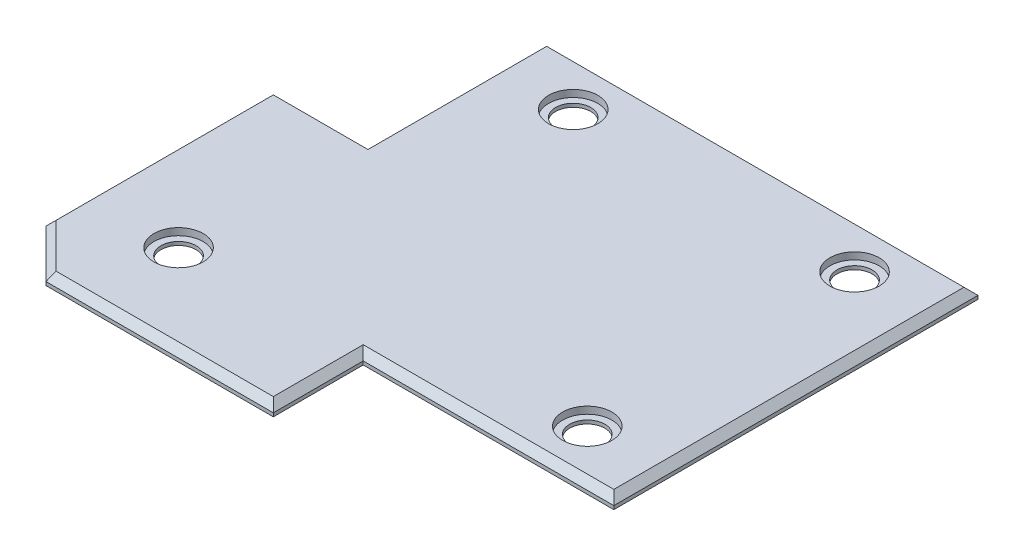
ISO-10303-21;
HEADER;
FILE_DESCRIPTION(('STEP AP214'),'2;1');
FILE_NAME('part.step','',(''),(''),'','','');
FILE_SCHEMA(('AUTOMOTIVE_DESIGN { 1 0 10303 214 1 1 1 1 }'));
ENDSEC;
DATA;
#1=APPLICATION_CONTEXT('core data for automotive mechanical design processes');
#2=APPLICATION_PROTOCOL_DEFINITION('international standard','automotive_design',2000,#1);
#3=PRODUCT_CONTEXT('',#1,'mechanical');
#4=PRODUCT('Part','Part','',(#3));
#5=PRODUCT_RELATED_PRODUCT_CATEGORY('part','',(#4));
#6=PRODUCT_DEFINITION_FORMATION('','',#4);
#7=PRODUCT_DEFINITION_CONTEXT('part definition',#1,'design');
#8=PRODUCT_DEFINITION('design','',#6,#7);
#9=PRODUCT_DEFINITION_SHAPE('','',#8);
#10=(LENGTH_UNIT() NAMED_UNIT(*) SI_UNIT(.MILLI.,.METRE.));
#11=(NAMED_UNIT(*) PLANE_ANGLE_UNIT() SI_UNIT($,.RADIAN.));
#12=(NAMED_UNIT(*) SI_UNIT($,.STERADIAN.) SOLID_ANGLE_UNIT());
#13=UNCERTAINTY_MEASURE_WITH_UNIT(LENGTH_MEASURE(1.E-05),#10,'distance_accuracy_value','');
#14=(GEOMETRIC_REPRESENTATION_CONTEXT(3) GLOBAL_UNCERTAINTY_ASSIGNED_CONTEXT((#13)) GLOBAL_UNIT_ASSIGNED_CONTEXT((#10,
#11,#12)) REPRESENTATION_CONTEXT('',''));
#15=CARTESIAN_POINT('',(0.,0.,0.));
#16=DIRECTION('',(0.,0.,1.));
#17=DIRECTION('',(1.,0.,0.));
#18=AXIS2_PLACEMENT_3D('',#15,#16,#17);
#19=CARTESIAN_POINT('',(21.1851643736294,1.5,-18.54562572709));
#20=DIRECTION('',(0.,1.,0.));
#21=DIRECTION('',(0.,0.,1.));
#22=AXIS2_PLACEMENT_3D('',#19,#20,#21);
#23=CYLINDRICAL_SURFACE('',#22,2.5);
#24=CARTESIAN_POINT('',(21.1851643736294,2.,-18.54562572709));
#25=DIRECTION('',(0.,-1.,0.));
#26=DIRECTION('',(0.,0.,-1.));
#27=AXIS2_PLACEMENT_3D('',#24,#25,#26);
#28=CIRCLE('',#27,2.5);
#29=CARTESIAN_POINT('',(21.1851643736294,2.,-21.04562572709));
#30=VERTEX_POINT('',#29);
#31=EDGE_CURVE('E188',#30,#30,#28,.T.);
#32=ORIENTED_EDGE('',*,*,#31,.T.);
#33=EDGE_LOOP('',(#32));
#34=FACE_BOUND('',#33,.T.);
#35=CARTESIAN_POINT('',(21.1851643736294,2.5,-18.54562572709));
#36=DIRECTION('',(0.,1.,0.));
#37=DIRECTION('',(0.,0.,1.));
#38=AXIS2_PLACEMENT_3D('',#35,#36,#37);
#39=CIRCLE('',#38,2.5);
#40=CARTESIAN_POINT('',(21.1851643736294,2.5,-16.04562572709));
#41=VERTEX_POINT('',#40);
#42=EDGE_CURVE('E192',#41,#41,#39,.F.);
#43=ORIENTED_EDGE('',*,*,#42,.F.);
#44=EDGE_LOOP('',(#43));
#45=FACE_BOUND('',#44,.T.);
#46=ADVANCED_FACE('F41',(#34,#45),#23,.F.);
#47=CARTESIAN_POINT('',(-18.8148356263706,1.5,-18.54562572709));
#48=DIRECTION('',(0.,1.,0.));
#49=DIRECTION('',(0.,0.,1.));
#50=AXIS2_PLACEMENT_3D('',#47,#48,#49);
#51=CYLINDRICAL_SURFACE('',#50,2.5);
#52=CARTESIAN_POINT('',(-18.8148356263706,2.,-18.54562572709));
#53=DIRECTION('',(0.,-1.,0.));
#54=DIRECTION('',(0.,0.,-1.));
#55=AXIS2_PLACEMENT_3D('',#52,#53,#54);
#56=CIRCLE('',#55,2.5);
#57=CARTESIAN_POINT('',(-18.8148356263706,2.,-21.04562572709));
#58=VERTEX_POINT('',#57);
#59=EDGE_CURVE('E191',#58,#58,#56,.T.);
#60=ORIENTED_EDGE('',*,*,#59,.T.);
#61=EDGE_LOOP('',(#60));
#62=FACE_BOUND('',#61,.T.);
#63=CARTESIAN_POINT('',(-18.8148356263706,2.5,-18.54562572709));
#64=DIRECTION('',(0.,1.,0.));
#65=DIRECTION('',(0.,0.,1.));
#66=AXIS2_PLACEMENT_3D('',#63,#64,#65);
#67=CIRCLE('',#66,2.5);
#68=CARTESIAN_POINT('',(-18.8148356263706,2.5,-16.04562572709));
#69=VERTEX_POINT('',#68);
#70=EDGE_CURVE('E208',#69,#69,#67,.F.);
#71=ORIENTED_EDGE('',*,*,#70,.F.);
#72=EDGE_LOOP('',(#71));
#73=FACE_BOUND('',#72,.T.);
#74=ADVANCED_FACE('F396',(#62,#73),#51,.F.);
#75=CARTESIAN_POINT('',(21.1851643736294,1.5,19.45437427291));
#76=DIRECTION('',(0.,1.,0.));
#77=DIRECTION('',(0.,0.,1.));
#78=AXIS2_PLACEMENT_3D('',#75,#76,#77);
#79=CYLINDRICAL_SURFACE('',#78,2.5);
#80=CARTESIAN_POINT('',(21.1851643736294,2.,19.45437427291));
#81=DIRECTION('',(0.,-1.,0.));
#82=DIRECTION('',(0.,0.,-1.));
#83=AXIS2_PLACEMENT_3D('',#80,#81,#82);
#84=CIRCLE('',#83,2.5);
#85=CARTESIAN_POINT('',(21.1851643736294,2.,16.95437427291));
#86=VERTEX_POINT('',#85);
#87=EDGE_CURVE('E195',#86,#86,#84,.T.);
#88=ORIENTED_EDGE('',*,*,#87,.T.);
#89=EDGE_LOOP('',(#88));
#90=FACE_BOUND('',#89,.T.);
#91=CARTESIAN_POINT('',(21.1851643736294,2.5,19.45437427291));
#92=DIRECTION('',(0.,1.,0.));
#93=DIRECTION('',(0.,0.,1.));
#94=AXIS2_PLACEMENT_3D('',#91,#92,#93);
#95=CIRCLE('',#94,2.5);
#96=CARTESIAN_POINT('',(21.1851643736294,2.5,21.95437427291));
#97=VERTEX_POINT('',#96);
#98=EDGE_CURVE('E204',#97,#97,#95,.F.);
#99=ORIENTED_EDGE('',*,*,#98,.F.);
#100=EDGE_LOOP('',(#99));
#101=FACE_BOUND('',#100,.T.);
#102=ADVANCED_FACE('F402',(#90,#101),#79,.F.);
#103=CARTESIAN_POINT('',(-29.8548356263706,1.5,26.5291378794875));
#104=DIRECTION('',(0.,1.,0.));
#105=DIRECTION('',(0.,0.,1.));
#106=AXIS2_PLACEMENT_3D('',#103,#104,#105);
#107=CYLINDRICAL_SURFACE('',#106,2.5);
#108=CARTESIAN_POINT('',(-29.8548356263706,2.,26.5291378794875));
#109=DIRECTION('',(0.,-1.,0.));
#110=DIRECTION('',(0.,0.,-1.));
#111=AXIS2_PLACEMENT_3D('',#108,#109,#110);
#112=CIRCLE('',#111,2.5);
#113=CARTESIAN_POINT('',(-29.8548356263706,2.,24.0291378794875));
#114=VERTEX_POINT('',#113);
#115=EDGE_CURVE('E198',#114,#114,#112,.T.);
#116=ORIENTED_EDGE('',*,*,#115,.T.);
#117=EDGE_LOOP('',(#116));
#118=FACE_BOUND('',#117,.T.);
#119=CARTESIAN_POINT('',(-29.8548356263706,2.5,26.5291378794875));
#120=DIRECTION('',(0.,1.,0.));
#121=DIRECTION('',(0.,0.,1.));
#122=AXIS2_PLACEMENT_3D('',#119,#120,#121);
#123=CIRCLE('',#122,2.5);
#124=CARTESIAN_POINT('',(-29.8548356263706,2.5,29.0291378794875));
#125=VERTEX_POINT('',#124);
#126=EDGE_CURVE('E201',#125,#125,#123,.F.);
#127=ORIENTED_EDGE('',*,*,#126,.F.);
#128=EDGE_LOOP('',(#127));
#129=FACE_BOUND('',#128,.T.);
#130=ADVANCED_FACE('F407',(#118,#129),#107,.F.);
#131=CARTESIAN_POINT('',(-29.4806035931873,3.5,-0.0264334137700193));
#132=DIRECTION('',(1.,0.,0.));
#133=DIRECTION('',(0.,0.,-1.));
#134=AXIS2_PLACEMENT_3D('',#131,#132,#133);
#135=PLANE('',#134);
#136=DIRECTION('',(0.,-1.,0.));
#137=VECTOR('',#136,1.);
#138=CARTESIAN_POINT('',(-29.4806035931873,3.5,-0.0264334137700193));
#139=LINE('',#138,#137);
#140=CARTESIAN_POINT('',(-29.4806035931873,2.49999999999999,-0.0264334137700193));
#141=VERTEX_POINT('',#140);
#142=CARTESIAN_POINT('',(-29.4806035931873,2.,-0.0264334137700193));
#143=VERTEX_POINT('',#142);
#144=EDGE_CURVE('E185',#141,#143,#139,.T.);
#145=ORIENTED_EDGE('',*,*,#144,.F.);
#146=DIRECTION('',(0.,0.,-1.));
#147=VECTOR('',#146,1.);
#148=CARTESIAN_POINT('',(-29.4806035931873,2.49999999999999,-0.0264334137700193));
#149=LINE('',#148,#147);
#150=CARTESIAN_POINT('',(-29.4806035931873,2.49999999999999,-25.4359182046136));
#151=VERTEX_POINT('',#150);
#152=EDGE_CURVE('E234',#141,#151,#149,.T.);
#153=ORIENTED_EDGE('',*,*,#152,.T.);
#154=DIRECTION('',(0.,-1.,0.));
#155=VECTOR('',#154,1.);
#156=CARTESIAN_POINT('',(-29.4806035931873,3.5,-25.4359182046136));
#157=LINE('',#156,#155);
#158=CARTESIAN_POINT('',(-29.4806035931873,2.,-25.4359182046136));
#159=VERTEX_POINT('',#158);
#160=EDGE_CURVE('E152',#151,#159,#157,.T.);
#161=ORIENTED_EDGE('',*,*,#160,.T.);
#162=DIRECTION('',(0.,0.,1.));
#163=VECTOR('',#162,1.);
#164=CARTESIAN_POINT('',(-29.4806035931873,2.,-0.0264334137700193));
#165=LINE('',#164,#163);
#166=EDGE_CURVE('E163',#159,#143,#165,.T.);
#167=ORIENTED_EDGE('',*,*,#166,.T.);
#168=EDGE_LOOP('',(#145,#153,#161,#167));
#169=FACE_BOUND('',#168,.T.);
#170=ADVANCED_FACE('F352',(#169),#135,.F.);
#171=CARTESIAN_POINT('',(-42.9335057092703,3.5,-0.0264334137700193));
#172=DIRECTION('',(0.,0.,1.));
#173=DIRECTION('',(1.,0.,0.));
#174=AXIS2_PLACEMENT_3D('',#171,#172,#173);
#175=PLANE('',#174);
#176=DIRECTION('',(0.,-1.,0.));
#177=VECTOR('',#176,1.);
#178=CARTESIAN_POINT('',(-42.9335057092703,3.5,-0.0264334137700193));
#179=LINE('',#178,#177);
#180=CARTESIAN_POINT('',(-42.9335057092703,2.49999999999999,-0.0264334137700193));
#181=VERTEX_POINT('',#180);
#182=CARTESIAN_POINT('',(-42.9335057092703,2.,-0.0264334137700176));
#183=VERTEX_POINT('',#182);
#184=EDGE_CURVE('E183',#181,#183,#179,.T.);
#185=ORIENTED_EDGE('',*,*,#184,.F.);
#186=DIRECTION('',(1.,0.,0.));
#187=VECTOR('',#186,1.);
#188=CARTESIAN_POINT('',(-42.9335057092703,2.49999999999999,-0.0264334137700193));
#189=LINE('',#188,#187);
#190=EDGE_CURVE('E231',#181,#141,#189,.T.);
#191=ORIENTED_EDGE('',*,*,#190,.T.);
#192=ORIENTED_EDGE('',*,*,#144,.T.);
#193=DIRECTION('',(-1.,0.,0.));
#194=VECTOR('',#193,1.);
#195=CARTESIAN_POINT('',(-42.9335057092703,2.,-0.0264334137700193));
#196=LINE('',#195,#194);
#197=EDGE_CURVE('E300',#143,#183,#196,.T.);
#198=ORIENTED_EDGE('',*,*,#197,.T.);
#199=EDGE_LOOP('',(#185,#191,#192,#198));
#200=FACE_BOUND('',#199,.T.);
#201=ADVANCED_FACE('F340',(#200),#175,.F.);
#202=CARTESIAN_POINT('',(-42.9335057092703,3.5,32.2961580116147));
#203=DIRECTION('',(1.,0.,0.));
#204=DIRECTION('',(0.,0.,-1.));
#205=AXIS2_PLACEMENT_3D('',#202,#203,#204);
#206=PLANE('',#205);
#207=DIRECTION('',(0.,-1.,0.));
#208=VECTOR('',#207,1.);
#209=CARTESIAN_POINT('',(-42.9335057092703,3.5,32.2961580116147));
#210=LINE('',#209,#208);
#211=CARTESIAN_POINT('',(-42.9335057092703,2.49999999999999,32.2961580116147));
#212=VERTEX_POINT('',#211);
#213=CARTESIAN_POINT('',(-42.9335057092703,2.,32.2961580116147));
#214=VERTEX_POINT('',#213);
#215=EDGE_CURVE('E181',#212,#214,#210,.T.);
#216=ORIENTED_EDGE('',*,*,#215,.F.);
#217=DIRECTION('',(0.,0.,-1.));
#218=VECTOR('',#217,1.);
#219=CARTESIAN_POINT('',(-42.9335057092703,2.49999999999999,32.2961580116147));
#220=LINE('',#219,#218);
#221=EDGE_CURVE('E11',#212,#181,#220,.T.);
#222=ORIENTED_EDGE('',*,*,#221,.T.);
#223=ORIENTED_EDGE('',*,*,#184,.T.);
#224=DIRECTION('',(0.,0.,1.));
#225=VECTOR('',#224,1.);
#226=CARTESIAN_POINT('',(-42.9335057092703,2.,32.2961580116147));
#227=LINE('',#226,#225);
#228=EDGE_CURVE('E303',#183,#214,#227,.T.);
#229=ORIENTED_EDGE('',*,*,#228,.T.);
#230=EDGE_LOOP('',(#216,#222,#223,#229));
#231=FACE_BOUND('',#230,.T.);
#232=ADVANCED_FACE('F336',(#231),#206,.F.);
#233=CARTESIAN_POINT('',(-36.1050785845241,3.5,39.1245851363609));
#234=DIRECTION('',(0.707106781186547,0.,-0.707106781186548));
#235=DIRECTION('',(-0.707106781186548,0.,-0.707106781186547));
#236=AXIS2_PLACEMENT_3D('',#233,#234,#235);
#237=PLANE('',#236);
#238=DIRECTION('',(0.,-1.,0.));
#239=VECTOR('',#238,1.);
#240=CARTESIAN_POINT('',(-36.1050785845241,3.5,39.1245851363609));
#241=LINE('',#240,#239);
#242=CARTESIAN_POINT('',(-36.1050785845241,2.49999999999998,39.1245851363609));
#243=VERTEX_POINT('',#242);
#244=CARTESIAN_POINT('',(-36.1050785845241,2.,39.1245851363609));
#245=VERTEX_POINT('',#244);
#246=EDGE_CURVE('E179',#243,#245,#241,.T.);
#247=ORIENTED_EDGE('',*,*,#246,.F.);
#248=DIRECTION('',(-0.707106781186548,0.,-0.707106781186547));
#249=VECTOR('',#248,1.);
#250=CARTESIAN_POINT('',(-36.1050785845241,2.49999999999998,39.1245851363609));
#251=LINE('',#250,#249);
#252=EDGE_CURVE('E51',#243,#212,#251,.T.);
#253=ORIENTED_EDGE('',*,*,#252,.T.);
#254=ORIENTED_EDGE('',*,*,#215,.T.);
#255=DIRECTION('',(0.707106781186548,0.,0.707106781186547));
#256=VECTOR('',#255,1.);
#257=CARTESIAN_POINT('',(-36.1050785845241,2.,39.1245851363609));
#258=LINE('',#257,#256);
#259=EDGE_CURVE('E306',#214,#245,#258,.T.);
#260=ORIENTED_EDGE('',*,*,#259,.T.);
#261=EDGE_LOOP('',(#247,#253,#254,#260));
#262=FACE_BOUND('',#261,.T.);
#263=ADVANCED_FACE('F321',(#262),#237,.F.);
#264=CARTESIAN_POINT('',(-3.78248715913939,3.5,39.1245851363609));
#265=DIRECTION('',(0.,0.,-1.));
#266=DIRECTION('',(-1.,0.,0.));
#267=AXIS2_PLACEMENT_3D('',#264,#265,#266);
#268=PLANE('',#267);
#269=DIRECTION('',(0.,-1.,0.));
#270=VECTOR('',#269,1.);
#271=CARTESIAN_POINT('',(-3.78248715913939,3.5,39.1245851363609));
#272=LINE('',#271,#270);
#273=CARTESIAN_POINT('',(-3.78248715913939,2.49999999999999,39.1245851363609));
#274=VERTEX_POINT('',#273);
#275=CARTESIAN_POINT('',(-3.78248715913939,2.,39.1245851363609));
#276=VERTEX_POINT('',#275);
#277=EDGE_CURVE('E177',#274,#276,#272,.T.);
#278=ORIENTED_EDGE('',*,*,#277,.F.);
#279=DIRECTION('',(-1.,0.,0.));
#280=VECTOR('',#279,1.);
#281=CARTESIAN_POINT('',(-3.78248715913939,2.49999999999999,39.1245851363609));
#282=LINE('',#281,#280);
#283=EDGE_CURVE('E66',#274,#243,#282,.T.);
#284=ORIENTED_EDGE('',*,*,#283,.T.);
#285=ORIENTED_EDGE('',*,*,#246,.T.);
#286=DIRECTION('',(1.,0.,0.));
#287=VECTOR('',#286,1.);
#288=CARTESIAN_POINT('',(-3.78248715913939,2.,39.1245851363609));
#289=LINE('',#288,#287);
#290=EDGE_CURVE('E309',#245,#276,#289,.T.);
#291=ORIENTED_EDGE('',*,*,#290,.T.);
#292=EDGE_LOOP('',(#278,#284,#285,#291));
#293=FACE_BOUND('',#292,.T.);
#294=ADVANCED_FACE('F318',(#293),#268,.F.);
#295=CARTESIAN_POINT('',(-3.78248715913939,3.5,26.3446667504336));
#296=DIRECTION('',(-1.,0.,0.));
#297=DIRECTION('',(0.,0.,1.));
#298=AXIS2_PLACEMENT_3D('',#295,#296,#297);
#299=PLANE('',#298);
#300=DIRECTION('',(0.,-1.,0.));
#301=VECTOR('',#300,1.);
#302=CARTESIAN_POINT('',(-3.78248715913939,3.5,26.3446667504336));
#303=LINE('',#302,#301);
#304=CARTESIAN_POINT('',(-3.78248715913939,2.49999999999999,26.3446667504336));
#305=VERTEX_POINT('',#304);
#306=CARTESIAN_POINT('',(-3.78248715913939,2.,26.3446667504336));
#307=VERTEX_POINT('',#306);
#308=EDGE_CURVE('E175',#305,#307,#303,.T.);
#309=ORIENTED_EDGE('',*,*,#308,.F.);
#310=DIRECTION('',(0.,0.,1.));
#311=VECTOR('',#310,1.);
#312=CARTESIAN_POINT('',(-3.78248715913939,2.49999999999999,26.3446667504336));
#313=LINE('',#312,#311);
#314=EDGE_CURVE('E241',#305,#274,#313,.T.);
#315=ORIENTED_EDGE('',*,*,#314,.T.);
#316=ORIENTED_EDGE('',*,*,#277,.T.);
#317=DIRECTION('',(0.,0.,-1.));
#318=VECTOR('',#317,1.);
#319=CARTESIAN_POINT('',(-3.78248715913939,2.,26.3446667504336));
#320=LINE('',#319,#318);
#321=EDGE_CURVE('E169',#276,#307,#320,.T.);
#322=ORIENTED_EDGE('',*,*,#321,.T.);
#323=EDGE_LOOP('',(#309,#315,#316,#322));
#324=FACE_BOUND('',#323,.T.);
#325=ADVANCED_FACE('F315',(#324),#299,.F.);
#326=CARTESIAN_POINT('',(31.8509323404461,3.5,26.3446667504336));
#327=DIRECTION('',(0.,0.,-1.));
#328=DIRECTION('',(-1.,0.,0.));
#329=AXIS2_PLACEMENT_3D('',#326,#327,#328);
#330=PLANE('',#329);
#331=DIRECTION('',(0.,-1.,0.));
#332=VECTOR('',#331,1.);
#333=CARTESIAN_POINT('',(31.8509323404461,3.5,26.3446667504336));
#334=LINE('',#333,#332);
#335=CARTESIAN_POINT('',(31.8509323404461,2.49999999999999,26.3446667504336));
#336=VERTEX_POINT('',#335);
#337=CARTESIAN_POINT('',(31.8509323404461,2.,26.3446667504336));
#338=VERTEX_POINT('',#337);
#339=EDGE_CURVE('E151',#336,#338,#334,.T.);
#340=ORIENTED_EDGE('',*,*,#339,.F.);
#341=DIRECTION('',(-1.,0.,0.));
#342=VECTOR('',#341,1.);
#343=CARTESIAN_POINT('',(31.8509323404461,2.49999999999999,26.3446667504336));
#344=LINE('',#343,#342);
#345=EDGE_CURVE('E239',#336,#305,#344,.T.);
#346=ORIENTED_EDGE('',*,*,#345,.T.);
#347=ORIENTED_EDGE('',*,*,#308,.T.);
#348=DIRECTION('',(1.,0.,0.));
#349=VECTOR('',#348,1.);
#350=CARTESIAN_POINT('',(31.8509323404461,2.,26.3446667504336));
#351=LINE('',#350,#349);
#352=EDGE_CURVE('E167',#307,#338,#351,.T.);
#353=ORIENTED_EDGE('',*,*,#352,.T.);
#354=EDGE_LOOP('',(#340,#346,#347,#353));
#355=FACE_BOUND('',#354,.T.);
#356=ADVANCED_FACE('F360',(#355),#330,.F.);
#357=CARTESIAN_POINT('',(31.8509323404461,3.5,-25.4359182046136));
#358=DIRECTION('',(-1.,0.,0.));
#359=DIRECTION('',(0.,0.,1.));
#360=AXIS2_PLACEMENT_3D('',#357,#358,#359);
#361=PLANE('',#360);
#362=DIRECTION('',(0.,-1.,0.));
#363=VECTOR('',#362,1.);
#364=CARTESIAN_POINT('',(31.8509323404461,3.5,-25.4359182046136));
#365=LINE('',#364,#363);
#366=CARTESIAN_POINT('',(31.8509323404461,2.49999999999999,-25.4359182046136));
#367=VERTEX_POINT('',#366);
#368=CARTESIAN_POINT('',(31.8509323404461,2.,-25.4359182046136));
#369=VERTEX_POINT('',#368);
#370=EDGE_CURVE('E141',#367,#369,#365,.T.);
#371=ORIENTED_EDGE('',*,*,#370,.F.);
#372=DIRECTION('',(0.,0.,1.));
#373=VECTOR('',#372,1.);
#374=CARTESIAN_POINT('',(31.8509323404461,2.49999999999999,-25.4359182046136));
#375=LINE('',#374,#373);
#376=EDGE_CURVE('E237',#367,#336,#375,.T.);
#377=ORIENTED_EDGE('',*,*,#376,.T.);
#378=ORIENTED_EDGE('',*,*,#339,.T.);
#379=DIRECTION('',(0.,0.,-1.));
#380=VECTOR('',#379,1.);
#381=CARTESIAN_POINT('',(31.8509323404461,2.,-25.4359182046136));
#382=LINE('',#381,#380);
#383=EDGE_CURVE('E159',#338,#369,#382,.T.);
#384=ORIENTED_EDGE('',*,*,#383,.T.);
#385=EDGE_LOOP('',(#371,#377,#378,#384));
#386=FACE_BOUND('',#385,.T.);
#387=ADVANCED_FACE('F165',(#386),#361,.F.);
#388=CARTESIAN_POINT('',(-29.4806035931873,3.5,-25.4359182046136));
#389=DIRECTION('',(0.,0.,1.));
#390=DIRECTION('',(1.,0.,0.));
#391=AXIS2_PLACEMENT_3D('',#388,#389,#390);
#392=PLANE('',#391);
#393=ORIENTED_EDGE('',*,*,#160,.F.);
#394=DIRECTION('',(1.,0.,0.));
#395=VECTOR('',#394,1.);
#396=CARTESIAN_POINT('',(-29.4806035931873,2.49999999999999,-25.4359182046136));
#397=LINE('',#396,#395);
#398=EDGE_CURVE('E147',#151,#367,#397,.T.);
#399=ORIENTED_EDGE('',*,*,#398,.T.);
#400=ORIENTED_EDGE('',*,*,#370,.T.);
#401=DIRECTION('',(-1.,0.,0.));
#402=VECTOR('',#401,1.);
#403=CARTESIAN_POINT('',(-29.4806035931873,2.,-25.4359182046136));
#404=LINE('',#403,#402);
#405=EDGE_CURVE('E145',#369,#159,#404,.T.);
#406=ORIENTED_EDGE('',*,*,#405,.T.);
#407=EDGE_LOOP('',(#393,#399,#400,#406));
#408=FACE_BOUND('',#407,.T.);
#409=ADVANCED_FACE('F144',(#408),#392,.F.);
#410=CARTESIAN_POINT('',(0.,3.5,0.));
#411=DIRECTION('',(0.,-1.,0.));
#412=DIRECTION('',(0.,0.,-1.));
#413=AXIS2_PLACEMENT_3D('',#410,#411,#412);
#414=PLANE('',#413);
#415=DIRECTION('',(0.,0.,1.));
#416=VECTOR('',#415,1.);
#417=CARTESIAN_POINT('',(-28.4806035931873,3.5,0.));
#418=LINE('',#417,#416);
#419=CARTESIAN_POINT('',(-28.4806035931873,3.5,-24.4359182046136));
#420=VERTEX_POINT('',#419);
#421=CARTESIAN_POINT('',(-28.4806035931873,3.5,0.973566586229982));
#422=VERTEX_POINT('',#421);
#423=EDGE_CURVE('E226',#420,#422,#418,.T.);
#424=ORIENTED_EDGE('',*,*,#423,.T.);
#425=DIRECTION('',(-1.,0.,0.));
#426=VECTOR('',#425,1.);
#427=CARTESIAN_POINT('',(0.,3.5,0.973566586229982));
#428=LINE('',#427,#426);
#429=CARTESIAN_POINT('',(-41.9335057092703,3.5,0.973566586229982));
#430=VERTEX_POINT('',#429);
#431=EDGE_CURVE('E228',#422,#430,#428,.T.);
#432=ORIENTED_EDGE('',*,*,#431,.T.);
#433=DIRECTION('',(0.,0.,1.));
#434=VECTOR('',#433,1.);
#435=CARTESIAN_POINT('',(-41.9335057092703,3.5,0.));
#436=LINE('',#435,#434);
#437=CARTESIAN_POINT('',(-41.9335057092703,3.5,31.8819444492416));
#438=VERTEX_POINT('',#437);
#439=EDGE_CURVE('E187',#430,#438,#436,.T.);
#440=ORIENTED_EDGE('',*,*,#439,.T.);
#441=DIRECTION('',(0.707106781186548,0.,0.707106781186547));
#442=VECTOR('',#441,1.);
#443=CARTESIAN_POINT('',(-36.9077250792559,3.5,36.9077250792559));
#444=LINE('',#443,#442);
#445=CARTESIAN_POINT('',(-35.690865022151,3.5,38.1245851363609));
#446=VERTEX_POINT('',#445);
#447=EDGE_CURVE('E214',#438,#446,#444,.T.);
#448=ORIENTED_EDGE('',*,*,#447,.T.);
#449=DIRECTION('',(1.,0.,0.));
#450=VECTOR('',#449,1.);
#451=CARTESIAN_POINT('',(0.,3.5,38.1245851363609));
#452=LINE('',#451,#450);
#453=CARTESIAN_POINT('',(-4.78248715913939,3.5,38.1245851363609));
#454=VERTEX_POINT('',#453);
#455=EDGE_CURVE('E216',#446,#454,#452,.T.);
#456=ORIENTED_EDGE('',*,*,#455,.T.);
#457=DIRECTION('',(0.,0.,-1.));
#458=VECTOR('',#457,1.);
#459=CARTESIAN_POINT('',(-4.7824871591394,3.5,0.));
#460=LINE('',#459,#458);
#461=CARTESIAN_POINT('',(-4.78248715913939,3.5,25.3446667504336));
#462=VERTEX_POINT('',#461);
#463=EDGE_CURVE('E218',#454,#462,#460,.T.);
#464=ORIENTED_EDGE('',*,*,#463,.T.);
#465=DIRECTION('',(1.,0.,0.));
#466=VECTOR('',#465,1.);
#467=CARTESIAN_POINT('',(0.,3.5,25.3446667504336));
#468=LINE('',#467,#466);
#469=CARTESIAN_POINT('',(30.8509323404461,3.5,25.3446667504336));
#470=VERTEX_POINT('',#469);
#471=EDGE_CURVE('E220',#462,#470,#468,.T.);
#472=ORIENTED_EDGE('',*,*,#471,.T.);
#473=DIRECTION('',(0.,0.,-1.));
#474=VECTOR('',#473,1.);
#475=CARTESIAN_POINT('',(30.8509323404461,3.5,0.));
#476=LINE('',#475,#474);
#477=CARTESIAN_POINT('',(30.8509323404461,3.5,-24.4359182046136));
#478=VERTEX_POINT('',#477);
#479=EDGE_CURVE('E222',#470,#478,#476,.T.);
#480=ORIENTED_EDGE('',*,*,#479,.T.);
#481=DIRECTION('',(-1.,0.,0.));
#482=VECTOR('',#481,1.);
#483=CARTESIAN_POINT('',(0.,3.5,-24.4359182046136));
#484=LINE('',#483,#482);
#485=EDGE_CURVE('E224',#478,#420,#484,.T.);
#486=ORIENTED_EDGE('',*,*,#485,.T.);
#487=EDGE_LOOP('',(#424,#432,#440,#448,#456,#464,#472,#480,#486));
#488=FACE_BOUND('',#487,.T.);
#489=CARTESIAN_POINT('',(21.1851643736294,3.5,-18.54562572709));
#490=DIRECTION('',(0.,1.,0.));
#491=DIRECTION('',(0.,0.,1.));
#492=AXIS2_PLACEMENT_3D('',#489,#490,#491);
#493=CIRCLE('',#492,3.5);
#494=CARTESIAN_POINT('',(21.1851643736294,3.5,-15.04562572709));
#495=VERTEX_POINT('',#494);
#496=EDGE_CURVE('E283',#495,#495,#493,.T.);
#497=ORIENTED_EDGE('',*,*,#496,.F.);
#498=EDGE_LOOP('',(#497));
#499=FACE_BOUND('',#498,.T.);
#500=CARTESIAN_POINT('',(-29.8548356263706,3.5,26.5291378794875));
#501=DIRECTION('',(0.,1.,0.));
#502=DIRECTION('',(0.,0.,1.));
#503=AXIS2_PLACEMENT_3D('',#500,#501,#502);
#504=CIRCLE('',#503,3.5);
#505=CARTESIAN_POINT('',(-29.8548356263706,3.5,30.0291378794875));
#506=VERTEX_POINT('',#505);
#507=EDGE_CURVE('E290',#506,#506,#504,.T.);
#508=ORIENTED_EDGE('',*,*,#507,.F.);
#509=EDGE_LOOP('',(#508));
#510=FACE_BOUND('',#509,.T.);
#511=CARTESIAN_POINT('',(21.1851643736294,3.5,19.45437427291));
#512=DIRECTION('',(0.,1.,0.));
#513=DIRECTION('',(0.,0.,1.));
#514=AXIS2_PLACEMENT_3D('',#511,#512,#513);
#515=CIRCLE('',#514,3.5);
#516=CARTESIAN_POINT('',(21.1851643736294,3.5,22.95437427291));
#517=VERTEX_POINT('',#516);
#518=EDGE_CURVE('E275',#517,#517,#515,.T.);
#519=ORIENTED_EDGE('',*,*,#518,.F.);
#520=EDGE_LOOP('',(#519));
#521=FACE_BOUND('',#520,.T.);
#522=CARTESIAN_POINT('',(-18.8148356263706,3.5,-18.54562572709));
#523=DIRECTION('',(0.,1.,0.));
#524=DIRECTION('',(0.,0.,1.));
#525=AXIS2_PLACEMENT_3D('',#522,#523,#524);
#526=CIRCLE('',#525,3.5);
#527=CARTESIAN_POINT('',(-18.8148356263706,3.5,-15.04562572709));
#528=VERTEX_POINT('',#527);
#529=EDGE_CURVE('E286',#528,#528,#526,.T.);
#530=ORIENTED_EDGE('',*,*,#529,.F.);
#531=EDGE_LOOP('',(#530));
#532=FACE_BOUND('',#531,.T.);
#533=ADVANCED_FACE('F365',(#488,#499,#510,#521,#532),#414,.F.);
#534=CARTESIAN_POINT('',(0.,2.,0.));
#535=DIRECTION('',(0.,-1.,0.));
#536=DIRECTION('',(0.,0.,-1.));
#537=AXIS2_PLACEMENT_3D('',#534,#535,#536);
#538=PLANE('',#537);
#539=ORIENTED_EDGE('',*,*,#115,.F.);
#540=EDGE_LOOP('',(#539));
#541=FACE_BOUND('',#540,.T.);
#542=ORIENTED_EDGE('',*,*,#87,.F.);
#543=EDGE_LOOP('',(#542));
#544=FACE_BOUND('',#543,.T.);
#545=ORIENTED_EDGE('',*,*,#59,.F.);
#546=EDGE_LOOP('',(#545));
#547=FACE_BOUND('',#546,.T.);
#548=ORIENTED_EDGE('',*,*,#31,.F.);
#549=EDGE_LOOP('',(#548));
#550=FACE_BOUND('',#549,.T.);
#551=ORIENTED_EDGE('',*,*,#166,.F.);
#552=ORIENTED_EDGE('',*,*,#405,.F.);
#553=ORIENTED_EDGE('',*,*,#383,.F.);
#554=ORIENTED_EDGE('',*,*,#352,.F.);
#555=ORIENTED_EDGE('',*,*,#321,.F.);
#556=ORIENTED_EDGE('',*,*,#290,.F.);
#557=ORIENTED_EDGE('',*,*,#259,.F.);
#558=ORIENTED_EDGE('',*,*,#228,.F.);
#559=ORIENTED_EDGE('',*,*,#197,.F.);
#560=EDGE_LOOP('',(#551,#552,#553,#554,#555,#556,#557,#558,#559));
#561=FACE_BOUND('',#560,.T.);
#562=ADVANCED_FACE('F157',(#541,#544,#547,#550,#561),#538,.T.);
#563=CARTESIAN_POINT('',(-29.8548356263706,2.5,26.5291378794875));
#564=DIRECTION('',(0.,1.,0.));
#565=DIRECTION('',(0.,0.,1.));
#566=AXIS2_PLACEMENT_3D('',#563,#564,#565);
#567=PLANE('',#566);
#568=CARTESIAN_POINT('',(-29.8548356263706,2.5,26.5291378794875));
#569=DIRECTION('',(0.,1.,0.));
#570=DIRECTION('',(0.,0.,1.));
#571=AXIS2_PLACEMENT_3D('',#568,#569,#570);
#572=CIRCLE('',#571,3.5);
#573=CARTESIAN_POINT('',(-29.8548356263706,2.5,30.0291378794875));
#574=VERTEX_POINT('',#573);
#575=EDGE_CURVE('E280',#574,#574,#572,.T.);
#576=ORIENTED_EDGE('',*,*,#575,.T.);
#577=EDGE_LOOP('',(#576));
#578=FACE_BOUND('',#577,.T.);
#579=ORIENTED_EDGE('',*,*,#126,.T.);
#580=EDGE_LOOP('',(#579));
#581=FACE_BOUND('',#580,.T.);
#582=ADVANCED_FACE('F410',(#578,#581),#567,.T.);
#583=CARTESIAN_POINT('',(-29.8548356263706,2.5,26.5291378794875));
#584=DIRECTION('',(0.,1.,0.));
#585=DIRECTION('',(0.,0.,1.));
#586=AXIS2_PLACEMENT_3D('',#583,#584,#585);
#587=CYLINDRICAL_SURFACE('',#586,3.5);
#588=ORIENTED_EDGE('',*,*,#575,.F.);
#589=EDGE_LOOP('',(#588));
#590=FACE_BOUND('',#589,.T.);
#591=ORIENTED_EDGE('',*,*,#507,.T.);
#592=EDGE_LOOP('',(#591));
#593=FACE_BOUND('',#592,.T.);
#594=ADVANCED_FACE('F485',(#590,#593),#587,.F.);
#595=CARTESIAN_POINT('',(21.1851643736294,2.5,19.45437427291));
#596=DIRECTION('',(0.,1.,0.));
#597=DIRECTION('',(0.,0.,1.));
#598=AXIS2_PLACEMENT_3D('',#595,#596,#597);
#599=PLANE('',#598);
#600=CARTESIAN_POINT('',(21.1851643736294,2.5,19.45437427291));
#601=DIRECTION('',(0.,1.,0.));
#602=DIRECTION('',(0.,0.,1.));
#603=AXIS2_PLACEMENT_3D('',#600,#601,#602);
#604=CIRCLE('',#603,3.5);
#605=CARTESIAN_POINT('',(21.1851643736294,2.5,22.95437427291));
#606=VERTEX_POINT('',#605);
#607=EDGE_CURVE('E269',#606,#606,#604,.T.);
#608=ORIENTED_EDGE('',*,*,#607,.T.);
#609=EDGE_LOOP('',(#608));
#610=FACE_BOUND('',#609,.T.);
#611=ORIENTED_EDGE('',*,*,#98,.T.);
#612=EDGE_LOOP('',(#611));
#613=FACE_BOUND('',#612,.T.);
#614=ADVANCED_FACE('F482',(#610,#613),#599,.T.);
#615=CARTESIAN_POINT('',(21.1851643736294,2.5,19.45437427291));
#616=DIRECTION('',(0.,1.,0.));
#617=DIRECTION('',(0.,0.,1.));
#618=AXIS2_PLACEMENT_3D('',#615,#616,#617);
#619=CYLINDRICAL_SURFACE('',#618,3.5);
#620=ORIENTED_EDGE('',*,*,#607,.F.);
#621=EDGE_LOOP('',(#620));
#622=FACE_BOUND('',#621,.T.);
#623=ORIENTED_EDGE('',*,*,#518,.T.);
#624=EDGE_LOOP('',(#623));
#625=FACE_BOUND('',#624,.T.);
#626=ADVANCED_FACE('F390',(#622,#625),#619,.F.);
#627=CARTESIAN_POINT('',(-18.8148356263706,2.5,-18.54562572709));
#628=DIRECTION('',(0.,1.,0.));
#629=DIRECTION('',(0.,0.,1.));
#630=AXIS2_PLACEMENT_3D('',#627,#628,#629);
#631=PLANE('',#630);
#632=CARTESIAN_POINT('',(-18.8148356263706,2.5,-18.54562572709));
#633=DIRECTION('',(0.,1.,0.));
#634=DIRECTION('',(0.,0.,1.));
#635=AXIS2_PLACEMENT_3D('',#632,#633,#634);
#636=CIRCLE('',#635,3.5);
#637=CARTESIAN_POINT('',(-18.8148356263706,2.5,-15.04562572709));
#638=VERTEX_POINT('',#637);
#639=EDGE_CURVE('E205',#638,#638,#636,.T.);
#640=ORIENTED_EDGE('',*,*,#639,.T.);
#641=EDGE_LOOP('',(#640));
#642=FACE_BOUND('',#641,.T.);
#643=ORIENTED_EDGE('',*,*,#70,.T.);
#644=EDGE_LOOP('',(#643));
#645=FACE_BOUND('',#644,.T.);
#646=ADVANCED_FACE('F380',(#642,#645),#631,.T.);
#647=CARTESIAN_POINT('',(-18.8148356263706,2.5,-18.54562572709));
#648=DIRECTION('',(0.,1.,0.));
#649=DIRECTION('',(0.,0.,1.));
#650=AXIS2_PLACEMENT_3D('',#647,#648,#649);
#651=CYLINDRICAL_SURFACE('',#650,3.5);
#652=ORIENTED_EDGE('',*,*,#639,.F.);
#653=EDGE_LOOP('',(#652));
#654=FACE_BOUND('',#653,.T.);
#655=ORIENTED_EDGE('',*,*,#529,.T.);
#656=EDGE_LOOP('',(#655));
#657=FACE_BOUND('',#656,.T.);
#658=ADVANCED_FACE('F377',(#654,#657),#651,.F.);
#659=CARTESIAN_POINT('',(21.1851643736294,2.5,-18.54562572709));
#660=DIRECTION('',(0.,1.,0.));
#661=DIRECTION('',(0.,0.,1.));
#662=AXIS2_PLACEMENT_3D('',#659,#660,#661);
#663=PLANE('',#662);
#664=CARTESIAN_POINT('',(21.1851643736294,2.5,-18.54562572709));
#665=DIRECTION('',(0.,1.,0.));
#666=DIRECTION('',(0.,0.,1.));
#667=AXIS2_PLACEMENT_3D('',#664,#665,#666);
#668=CIRCLE('',#667,3.5);
#669=CARTESIAN_POINT('',(21.1851643736294,2.5,-15.04562572709));
#670=VERTEX_POINT('',#669);
#671=EDGE_CURVE('E287',#670,#670,#668,.T.);
#672=ORIENTED_EDGE('',*,*,#671,.T.);
#673=EDGE_LOOP('',(#672));
#674=FACE_BOUND('',#673,.T.);
#675=ORIENTED_EDGE('',*,*,#42,.T.);
#676=EDGE_LOOP('',(#675));
#677=FACE_BOUND('',#676,.T.);
#678=ADVANCED_FACE('F379',(#674,#677),#663,.T.);
#679=CARTESIAN_POINT('',(21.1851643736294,2.5,-18.54562572709));
#680=DIRECTION('',(0.,1.,0.));
#681=DIRECTION('',(0.,0.,1.));
#682=AXIS2_PLACEMENT_3D('',#679,#680,#681);
#683=CYLINDRICAL_SURFACE('',#682,3.5);
#684=ORIENTED_EDGE('',*,*,#671,.F.);
#685=EDGE_LOOP('',(#684));
#686=FACE_BOUND('',#685,.T.);
#687=ORIENTED_EDGE('',*,*,#496,.T.);
#688=EDGE_LOOP('',(#687));
#689=FACE_BOUND('',#688,.T.);
#690=ADVANCED_FACE('F387',(#686,#689),#683,.F.);
#691=CARTESIAN_POINT('',(0.,3.5,25.3446667504336));
#692=DIRECTION('',(0.,-0.707106781186542,-0.707106781186553));
#693=DIRECTION('',(1.,0.,0.));
#694=AXIS2_PLACEMENT_3D('',#691,#692,#693);
#695=PLANE('',#694);
#696=DIRECTION('',(-0.577350269189623,0.577350269189631,-0.577350269189623));
#697=VECTOR('',#696,1.);
#698=CARTESIAN_POINT('',(20.5672882269641,13.7836441134821,15.0610226369517));
#699=LINE('',#698,#697);
#700=EDGE_CURVE('E263',#470,#336,#699,.F.);
#701=ORIENTED_EDGE('',*,*,#700,.F.);
#702=ORIENTED_EDGE('',*,*,#471,.F.);
#703=DIRECTION('',(-0.577350269189623,0.577350269189631,-0.577350269189623));
#704=VECTOR('',#703,1.);
#705=CARTESIAN_POINT('',(-3.18832477275961,1.90583761362019,26.9388291368134));
#706=LINE('',#705,#704);
#707=EDGE_CURVE('E46',#305,#462,#706,.T.);
#708=ORIENTED_EDGE('',*,*,#707,.F.);
#709=ORIENTED_EDGE('',*,*,#345,.F.);
#710=EDGE_LOOP('',(#701,#702,#708,#709));
#711=FACE_BOUND('',#710,.T.);
#712=ADVANCED_FACE('F44',(#711),#695,.F.);
#713=CARTESIAN_POINT('',(-4.7824871591394,3.5,0.));
#714=DIRECTION('',(-0.707106781186553,-0.707106781186543,0.));
#715=DIRECTION('',(0.,0.,-1.));
#716=AXIS2_PLACEMENT_3D('',#713,#714,#715);
#717=PLANE('',#716);
#718=ORIENTED_EDGE('',*,*,#707,.T.);
#719=ORIENTED_EDGE('',*,*,#463,.F.);
#720=DIRECTION('',(-0.577350269189623,0.577350269189631,-0.577350269189623));
#721=VECTOR('',#720,1.);
#722=CARTESIAN_POINT('',(-3.18832477275961,1.9058376136202,39.7187475227407));
#723=LINE('',#722,#721);
#724=EDGE_CURVE('E261',#274,#454,#723,.T.);
#725=ORIENTED_EDGE('',*,*,#724,.F.);
#726=ORIENTED_EDGE('',*,*,#314,.F.);
#727=EDGE_LOOP('',(#718,#719,#725,#726));
#728=FACE_BOUND('',#727,.T.);
#729=ADVANCED_FACE('F363',(#728),#717,.F.);
#730=CARTESIAN_POINT('',(30.8509323404461,3.5,0.));
#731=DIRECTION('',(-0.707106781186552,-0.707106781186542,0.));
#732=DIRECTION('',(0.,0.,-1.));
#733=AXIS2_PLACEMENT_3D('',#730,#731,#732);
#734=PLANE('',#733);
#735=ORIENTED_EDGE('',*,*,#700,.T.);
#736=ORIENTED_EDGE('',*,*,#376,.F.);
#737=DIRECTION('',(-0.577350269189623,0.577350269189631,0.577350269189623));
#738=VECTOR('',#737,1.);
#739=CARTESIAN_POINT('',(22.7056262722416,11.6453060682046,-16.2906121364092));
#740=LINE('',#739,#738);
#741=EDGE_CURVE('E258',#478,#367,#740,.F.);
#742=ORIENTED_EDGE('',*,*,#741,.F.);
#743=ORIENTED_EDGE('',*,*,#479,.F.);
#744=EDGE_LOOP('',(#735,#736,#742,#743));
#745=FACE_BOUND('',#744,.T.);
#746=ADVANCED_FACE('F357',(#745),#734,.F.);
#747=CARTESIAN_POINT('',(0.,3.5,38.1245851363609));
#748=DIRECTION('',(0.,-0.707106781186542,-0.707106781186552));
#749=DIRECTION('',(1.,0.,0.));
#750=AXIS2_PLACEMENT_3D('',#747,#748,#749);
#751=PLANE('',#750);
#752=ORIENTED_EDGE('',*,*,#724,.T.);
#753=ORIENTED_EDGE('',*,*,#455,.F.);
#754=DIRECTION('',(0.281084637714811,0.678598344545854,-0.678598344545844));
#755=VECTOR('',#754,1.);
#756=CARTESIAN_POINT('',(-35.5548991682077,3.82825060860952,37.7963345277514));
#757=LINE('',#756,#755);
#758=EDGE_CURVE('E255',#243,#446,#757,.T.);
#759=ORIENTED_EDGE('',*,*,#758,.F.);
#760=ORIENTED_EDGE('',*,*,#283,.F.);
#761=EDGE_LOOP('',(#752,#753,#759,#760));
#762=FACE_BOUND('',#761,.T.);
#763=ADVANCED_FACE('F324',(#762),#751,.F.);
#764=CARTESIAN_POINT('',(0.,3.5,-24.4359182046136));
#765=DIRECTION('',(0.,-0.707106781186542,0.707106781186552));
#766=DIRECTION('',(-1.,0.,0.));
#767=AXIS2_PLACEMENT_3D('',#764,#765,#766);
#768=PLANE('',#767);
#769=ORIENTED_EDGE('',*,*,#741,.T.);
#770=ORIENTED_EDGE('',*,*,#398,.F.);
#771=DIRECTION('',(0.577350269189623,0.577350269189631,0.577350269189623));
#772=VECTOR('',#771,1.);
#773=CARTESIAN_POINT('',(-18.987069062125,12.9935345310625,-14.9423836735513));
#774=LINE('',#773,#772);
#775=EDGE_CURVE('E252',#420,#151,#774,.F.);
#776=ORIENTED_EDGE('',*,*,#775,.F.);
#777=ORIENTED_EDGE('',*,*,#485,.F.);
#778=EDGE_LOOP('',(#769,#770,#776,#777));
#779=FACE_BOUND('',#778,.T.);
#780=ADVANCED_FACE('F354',(#779),#768,.F.);
#781=CARTESIAN_POINT('',(-36.9077250792559,3.5,36.9077250792559));
#782=DIRECTION('',(0.500000000000005,-0.70710678118654,-0.500000000000006));
#783=DIRECTION('',(0.707106781186548,0.,0.707106781186547));
#784=AXIS2_PLACEMENT_3D('',#781,#782,#783);
#785=PLANE('',#784);
#786=ORIENTED_EDGE('',*,*,#758,.T.);
#787=ORIENTED_EDGE('',*,*,#447,.F.);
#788=DIRECTION('',(0.678598344545844,0.678598344545854,-0.281084637714811));
#789=VECTOR('',#788,1.);
#790=CARTESIAN_POINT('',(-35.852229811883,9.58127589738737,29.3629974960112));
#791=LINE('',#790,#789);
#792=EDGE_CURVE('E249',#212,#438,#791,.T.);
#793=ORIENTED_EDGE('',*,*,#792,.F.);
#794=ORIENTED_EDGE('',*,*,#252,.F.);
#795=EDGE_LOOP('',(#786,#787,#793,#794));
#796=FACE_BOUND('',#795,.T.);
#797=ADVANCED_FACE('F328',(#796),#785,.F.);
#798=CARTESIAN_POINT('',(-28.4806035931873,3.5,0.));
#799=DIRECTION('',(0.707106781186552,-0.707106781186542,0.));
#800=DIRECTION('',(0.,0.,1.));
#801=AXIS2_PLACEMENT_3D('',#798,#799,#800);
#802=PLANE('',#801);
#803=ORIENTED_EDGE('',*,*,#775,.T.);
#804=ORIENTED_EDGE('',*,*,#152,.F.);
#805=DIRECTION('',(0.577350269189623,0.577350269189631,0.577350269189623));
#806=VECTOR('',#805,1.);
#807=CARTESIAN_POINT('',(-18.987069062125,12.9935345310625,10.4671011172923));
#808=LINE('',#807,#806);
#809=EDGE_CURVE('E247',#422,#141,#808,.F.);
#810=ORIENTED_EDGE('',*,*,#809,.F.);
#811=ORIENTED_EDGE('',*,*,#423,.F.);
#812=EDGE_LOOP('',(#803,#804,#810,#811));
#813=FACE_BOUND('',#812,.T.);
#814=ADVANCED_FACE('F349',(#813),#802,.F.);
#815=CARTESIAN_POINT('',(-41.9335057092703,3.5,0.));
#816=DIRECTION('',(0.707106781186552,-0.707106781186542,0.));
#817=DIRECTION('',(0.,0.,1.));
#818=AXIS2_PLACEMENT_3D('',#815,#816,#817);
#819=PLANE('',#818);
#820=ORIENTED_EDGE('',*,*,#792,.T.);
#821=ORIENTED_EDGE('',*,*,#439,.F.);
#822=DIRECTION('',(-0.577350269189623,-0.577350269189631,-0.577350269189623));
#823=VECTOR('',#822,1.);
#824=CARTESIAN_POINT('',(-42.2580279046803,3.17547780459,0.649044390819991));
#825=LINE('',#824,#823);
#826=EDGE_CURVE('E245',#181,#430,#825,.F.);
#827=ORIENTED_EDGE('',*,*,#826,.F.);
#828=ORIENTED_EDGE('',*,*,#221,.F.);
#829=EDGE_LOOP('',(#820,#821,#827,#828));
#830=FACE_BOUND('',#829,.T.);
#831=ADVANCED_FACE('F333',(#830),#819,.F.);
#832=CARTESIAN_POINT('',(0.,3.5,0.973566586229982));
#833=DIRECTION('',(0.,-0.707106781186542,0.707106781186552));
#834=DIRECTION('',(-1.,0.,0.));
#835=AXIS2_PLACEMENT_3D('',#832,#833,#834);
#836=PLANE('',#835);
#837=ORIENTED_EDGE('',*,*,#809,.T.);
#838=ORIENTED_EDGE('',*,*,#190,.F.);
#839=ORIENTED_EDGE('',*,*,#826,.T.);
#840=ORIENTED_EDGE('',*,*,#431,.F.);
#841=EDGE_LOOP('',(#837,#838,#839,#840));
#842=FACE_BOUND('',#841,.T.);
#843=ADVANCED_FACE('F343',(#842),#836,.F.);
#844=CLOSED_SHELL('',(#46,#74,#102,#130,#170,#201,#232,#263,#294,#325,#356,#387,#409,#533,#562,
#582,#594,#614,#626,#646,#658,#678,#690,#712,#729,#746,#763,#780,#797,#814,#831,#843));
#845=MANIFOLD_SOLID_BREP('B2',#844);
#846=ADVANCED_BREP_SHAPE_REPRESENTATION('',(#18,#845),#14);
#847=SHAPE_DEFINITION_REPRESENTATION(#9,#846);
ENDSEC;
END-ISO-10303-21;
